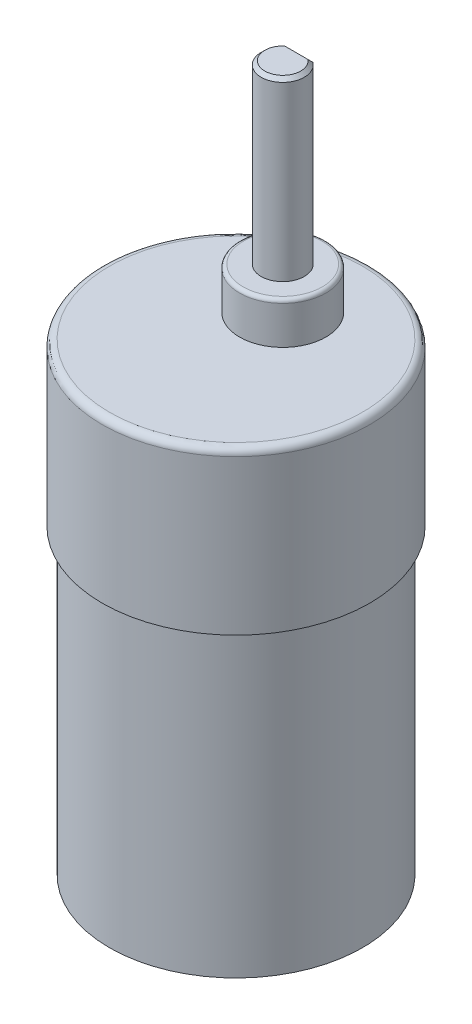
ISO-10303-21;
HEADER;
FILE_DESCRIPTION(('STEP AP214'),'2;1');
FILE_NAME('part.step','',(''),(''),'','','');
FILE_SCHEMA(('AUTOMOTIVE_DESIGN { 1 0 10303 214 1 1 1 1 }'));
ENDSEC;
DATA;
#1=APPLICATION_CONTEXT('core data for automotive mechanical design processes');
#2=APPLICATION_PROTOCOL_DEFINITION('international standard','automotive_design',2000,#1);
#3=PRODUCT_CONTEXT('',#1,'mechanical');
#4=PRODUCT('Part','Part','',(#3));
#5=PRODUCT_RELATED_PRODUCT_CATEGORY('part','',(#4));
#6=PRODUCT_DEFINITION_FORMATION('','',#4);
#7=PRODUCT_DEFINITION_CONTEXT('part definition',#1,'design');
#8=PRODUCT_DEFINITION('design','',#6,#7);
#9=PRODUCT_DEFINITION_SHAPE('','',#8);
#10=(LENGTH_UNIT() NAMED_UNIT(*) SI_UNIT(.MILLI.,.METRE.));
#11=(NAMED_UNIT(*) PLANE_ANGLE_UNIT() SI_UNIT($,.RADIAN.));
#12=(NAMED_UNIT(*) SI_UNIT($,.STERADIAN.) SOLID_ANGLE_UNIT());
#13=UNCERTAINTY_MEASURE_WITH_UNIT(LENGTH_MEASURE(1.E-05),#10,'distance_accuracy_value','');
#14=(GEOMETRIC_REPRESENTATION_CONTEXT(3) GLOBAL_UNCERTAINTY_ASSIGNED_CONTEXT((#13)) GLOBAL_UNIT_ASSIGNED_CONTEXT((#10,
#11,#12)) REPRESENTATION_CONTEXT('',''));
#15=CARTESIAN_POINT('',(0.,0.,0.));
#16=DIRECTION('',(0.,0.,1.));
#17=DIRECTION('',(1.,0.,0.));
#18=AXIS2_PLACEMENT_3D('',#15,#16,#17);
#19=CARTESIAN_POINT('',(0.,52.8,-6.5));
#20=DIRECTION('',(0.,-1.,0.));
#21=DIRECTION('',(0.,0.,-1.));
#22=AXIS2_PLACEMENT_3D('',#19,#20,#21);
#23=CYLINDRICAL_SURFACE('',#22,3.);
#24=DIRECTION('',(0.,-1.,0.));
#25=VECTOR('',#24,1.);
#26=CARTESIAN_POINT('',(1.8,52.8,-8.9));
#27=LINE('',#26,#25);
#28=CARTESIAN_POINT('',(1.8,52.3,-8.9));
#29=VERTEX_POINT('',#28);
#30=CARTESIAN_POINT('',(1.8,28.3,-8.9));
#31=VERTEX_POINT('',#30);
#32=EDGE_CURVE('E89',#29,#31,#27,.T.);
#33=ORIENTED_EDGE('',*,*,#32,.F.);
#34=CARTESIAN_POINT('',(0.,52.3,-6.5));
#35=DIRECTION('',(0.,1.,0.));
#36=DIRECTION('',(0.,0.,1.));
#37=AXIS2_PLACEMENT_3D('',#34,#35,#36);
#38=CIRCLE('',#37,3.);
#39=CARTESIAN_POINT('',(-1.8,52.3,-8.9));
#40=VERTEX_POINT('',#39);
#41=EDGE_CURVE('E12',#29,#40,#38,.F.);
#42=ORIENTED_EDGE('',*,*,#41,.T.);
#43=DIRECTION('',(0.,-1.,0.));
#44=VECTOR('',#43,1.);
#45=CARTESIAN_POINT('',(-1.8,52.8,-8.9));
#46=LINE('',#45,#44);
#47=CARTESIAN_POINT('',(-1.8,28.3,-8.9));
#48=VERTEX_POINT('',#47);
#49=EDGE_CURVE('E96',#40,#48,#46,.T.);
#50=ORIENTED_EDGE('',*,*,#49,.T.);
#51=CARTESIAN_POINT('',(0.,28.3,-6.5));
#52=DIRECTION('',(0.,1.,0.));
#53=DIRECTION('',(0.,0.,1.));
#54=AXIS2_PLACEMENT_3D('',#51,#52,#53);
#55=CIRCLE('',#54,3.);
#56=EDGE_CURVE('E100',#48,#31,#55,.T.);
#57=ORIENTED_EDGE('',*,*,#56,.T.);
#58=EDGE_LOOP('',(#33,#42,#50,#57));
#59=FACE_BOUND('',#58,.T.);
#60=ADVANCED_FACE('F49',(#59),#23,.T.);
#61=CARTESIAN_POINT('',(-1.8,52.8,-8.9));
#62=DIRECTION('',(0.,0.,1.));
#63=DIRECTION('',(1.,0.,0.));
#64=AXIS2_PLACEMENT_3D('',#61,#62,#63);
#65=PLANE('',#64);
#66=ORIENTED_EDGE('',*,*,#49,.F.);
#67=DIRECTION('',(1.,0.,0.));
#68=VECTOR('',#67,1.);
#69=CARTESIAN_POINT('',(1.8,52.3,-8.9));
#70=LINE('',#69,#68);
#71=EDGE_CURVE('E62',#40,#29,#70,.T.);
#72=ORIENTED_EDGE('',*,*,#71,.T.);
#73=ORIENTED_EDGE('',*,*,#32,.T.);
#74=DIRECTION('',(-1.,0.,0.));
#75=VECTOR('',#74,1.);
#76=CARTESIAN_POINT('',(-1.8,28.3,-8.9));
#77=LINE('',#76,#75);
#78=EDGE_CURVE('E92',#31,#48,#77,.T.);
#79=ORIENTED_EDGE('',*,*,#78,.T.);
#80=EDGE_LOOP('',(#66,#72,#73,#79));
#81=FACE_BOUND('',#80,.T.);
#82=ADVANCED_FACE('F91',(#81),#65,.F.);
#83=CARTESIAN_POINT('',(0.,52.8,-6.5));
#84=DIRECTION('',(0.,1.,0.));
#85=DIRECTION('',(0.,0.,1.));
#86=AXIS2_PLACEMENT_3D('',#83,#84,#85);
#87=PLANE('',#86);
#88=CARTESIAN_POINT('',(0.,52.8,-6.5));
#89=DIRECTION('',(0.,1.,0.));
#90=DIRECTION('',(0.,0.,1.));
#91=AXIS2_PLACEMENT_3D('',#88,#89,#90);
#92=CIRCLE('',#91,2.5);
#93=CARTESIAN_POINT('',(-1.62480768092719,52.8,-8.4));
#94=VERTEX_POINT('',#93);
#95=CARTESIAN_POINT('',(1.62480768092719,52.8,-8.4));
#96=VERTEX_POINT('',#95);
#97=EDGE_CURVE('E95',#94,#96,#92,.T.);
#98=ORIENTED_EDGE('',*,*,#97,.T.);
#99=DIRECTION('',(-1.,0.,0.));
#100=VECTOR('',#99,1.);
#101=CARTESIAN_POINT('',(-1.8,52.8,-8.4));
#102=LINE('',#101,#100);
#103=EDGE_CURVE('E107',#96,#94,#102,.T.);
#104=ORIENTED_EDGE('',*,*,#103,.T.);
#105=EDGE_LOOP('',(#98,#104));
#106=FACE_BOUND('',#105,.T.);
#107=ADVANCED_FACE('F123',(#106),#87,.T.);
#108=CARTESIAN_POINT('',(0.,28.3,-6.5));
#109=DIRECTION('',(0.,1.,0.));
#110=DIRECTION('',(0.,0.,1.));
#111=AXIS2_PLACEMENT_3D('',#108,#109,#110);
#112=PLANE('',#111);
#113=ORIENTED_EDGE('',*,*,#56,.F.);
#114=ORIENTED_EDGE('',*,*,#78,.F.);
#115=EDGE_LOOP('',(#113,#114));
#116=FACE_BOUND('',#115,.T.);
#117=ADVANCED_FACE('F99',(#116),#112,.F.);
#118=CARTESIAN_POINT('',(0.,52.8,-6.5));
#119=DIRECTION('',(0.,-1.,0.));
#120=DIRECTION('',(0.,0.,-1.));
#121=AXIS2_PLACEMENT_3D('',#118,#119,#120);
#122=CONICAL_SURFACE('',#121,2.5,0.785398163397443);
#123=CARTESIAN_POINT('',(-1.62480768092719,52.8,-8.4));
#124=CARTESIAN_POINT('',(-1.65541292897536,52.7169127929639,-8.48308720703609));
#125=CARTESIAN_POINT('',(-1.68531495795293,52.6337023873582,-8.56629761264177));
#126=CARTESIAN_POINT('',(-1.74371238852874,52.4670357190947,-8.73296428090534));
#127=CARTESIAN_POINT('',(-1.7722077992421,52.3835794580337,-8.81642054196633));
#128=CARTESIAN_POINT('',(-1.8,52.3,-8.9));
#129=B_SPLINE_CURVE_WITH_KNOTS('',3,(#123,#124,#125,#126,#127,#128),.UNSPECIFIED.,.F.,.F.,(4,2,
4),(0.,0.36425083507371,0.728499309429532),.UNSPECIFIED.);
#130=EDGE_CURVE('E103',#40,#94,#129,.F.);
#131=ORIENTED_EDGE('',*,*,#130,.F.);
#132=ORIENTED_EDGE('',*,*,#41,.F.);
#133=CARTESIAN_POINT('',(1.8,52.3,-8.9));
#134=CARTESIAN_POINT('',(1.7722077992421,52.3835794580337,-8.81642054196633));
#135=CARTESIAN_POINT('',(1.74371238852874,52.4670357190947,-8.73296428090534));
#136=CARTESIAN_POINT('',(1.68531495795293,52.6337023873582,-8.56629761264177));
#137=CARTESIAN_POINT('',(1.65541292897536,52.7169127929639,-8.48308720703609));
#138=CARTESIAN_POINT('',(1.62480768092719,52.8,-8.4));
#139=B_SPLINE_CURVE_WITH_KNOTS('',3,(#133,#134,#135,#136,#137,#138),.UNSPECIFIED.,.F.,.F.,(4,2,
4),(0.,0.364248474355822,0.728499309429532),.UNSPECIFIED.);
#140=EDGE_CURVE('E54',#96,#29,#139,.F.);
#141=ORIENTED_EDGE('',*,*,#140,.F.);
#142=ORIENTED_EDGE('',*,*,#97,.F.);
#143=EDGE_LOOP('',(#131,#132,#141,#142));
#144=FACE_BOUND('',#143,.T.);
#145=ADVANCED_FACE('F113',(#144),#122,.T.);
#146=CARTESIAN_POINT('',(0.,52.8,-8.4));
#147=DIRECTION('',(0.,0.707106781186544,-0.707106781186551));
#148=DIRECTION('',(0.,0.707106781186551,0.707106781186544));
#149=AXIS2_PLACEMENT_3D('',#146,#147,#148);
#150=PLANE('',#149);
#151=ORIENTED_EDGE('',*,*,#140,.T.);
#152=ORIENTED_EDGE('',*,*,#71,.F.);
#153=ORIENTED_EDGE('',*,*,#130,.T.);
#154=ORIENTED_EDGE('',*,*,#103,.F.);
#155=EDGE_LOOP('',(#151,#152,#153,#154));
#156=FACE_BOUND('',#155,.T.);
#157=ADVANCED_FACE('F51',(#156),#150,.T.);
#158=CLOSED_SHELL('',(#60,#82,#107,#117,#145,#157));
#159=MANIFOLD_SOLID_BREP('B2',#158);
#160=CARTESIAN_POINT('',(9.03438594613245,-46.,-9.8));
#161=DIRECTION('',(0.931562549804886,0.,0.363581099345139));
#162=DIRECTION('',(0.363581099345139,0.,-0.931562549804886));
#163=AXIS2_PLACEMENT_3D('',#160,#161,#162);
#164=PLANE('',#163);
#165=DIRECTION('',(0.363581099345139,0.,-0.931562549804886));
#166=VECTOR('',#165,1.);
#167=CARTESIAN_POINT('',(9.03438594613245,-46.,-9.8));
#168=LINE('',#167,#166);
#169=CARTESIAN_POINT('',(8.12543319776952,-46.,-7.47109362548758));
#170=VERTEX_POINT('',#169);
#171=CARTESIAN_POINT('',(8.85259539645988,-46.,-9.33421872509756));
#172=VERTEX_POINT('',#171);
#173=EDGE_CURVE('E297',#170,#172,#168,.T.);
#174=ORIENTED_EDGE('',*,*,#173,.F.);
#175=DIRECTION('',(0.257090660858204,-0.707106781186558,-0.658714196066456));
#176=VECTOR('',#175,1.);
#177=CARTESIAN_POINT('',(8.12543319776952,-46.,-7.47109362548758));
#178=LINE('',#177,#176);
#179=CARTESIAN_POINT('',(7.94364264809696,-45.5,-7.00531235058515));
#180=VERTEX_POINT('',#179);
#181=EDGE_CURVE('E364',#170,#180,#178,.F.);
#182=ORIENTED_EDGE('',*,*,#181,.T.);
#183=DIRECTION('',(0.,1.,0.));
#184=VECTOR('',#183,1.);
#185=CARTESIAN_POINT('',(7.94364264809696,-46.,-7.00531235058515));
#186=LINE('',#185,#184);
#187=CARTESIAN_POINT('',(7.94364264809696,-41.,-7.00531235058515));
#188=VERTEX_POINT('',#187);
#189=EDGE_CURVE('E282',#180,#188,#186,.T.);
#190=ORIENTED_EDGE('',*,*,#189,.T.);
#191=DIRECTION('',(0.363581099345139,0.,-0.931562549804886));
#192=VECTOR('',#191,1.);
#193=CARTESIAN_POINT('',(9.03438594613245,-41.,-9.8));
#194=LINE('',#193,#192);
#195=CARTESIAN_POINT('',(9.03438594613245,-41.,-9.8));
#196=VERTEX_POINT('',#195);
#197=EDGE_CURVE('E278',#188,#196,#194,.T.);
#198=ORIENTED_EDGE('',*,*,#197,.T.);
#199=DIRECTION('',(0.,1.,0.));
#200=VECTOR('',#199,1.);
#201=CARTESIAN_POINT('',(9.03438594613245,-46.,-9.8));
#202=LINE('',#201,#200);
#203=CARTESIAN_POINT('',(9.03438594613245,-45.5,-9.8));
#204=VERTEX_POINT('',#203);
#205=EDGE_CURVE('E263',#204,#196,#202,.T.);
#206=ORIENTED_EDGE('',*,*,#205,.F.);
#207=DIRECTION('',(0.257090660858206,0.707106781186553,-0.65871419606646));
#208=VECTOR('',#207,1.);
#209=CARTESIAN_POINT('',(8.85259539645988,-46.,-9.33421872509756));
#210=LINE('',#209,#208);
#211=EDGE_CURVE('E362',#204,#172,#210,.F.);
#212=ORIENTED_EDGE('',*,*,#211,.T.);
#213=EDGE_LOOP('',(#174,#182,#190,#198,#206,#212));
#214=FACE_BOUND('',#213,.T.);
#215=CARTESIAN_POINT('',(8.48901429711467,-45.,-8.40265617529258));
#216=DIRECTION('',(0.931562549804886,0.,0.363581099345139));
#217=DIRECTION('',(0.363581099345139,0.,-0.931562549804886));
#218=AXIS2_PLACEMENT_3D('',#215,#216,#217);
#219=CIRCLE('',#218,0.500000000000004);
#220=CARTESIAN_POINT('',(8.67080484678724,-45.,-8.86843745019503));
#221=VERTEX_POINT('',#220);
#222=EDGE_CURVE('E356',#221,#221,#219,.T.);
#223=ORIENTED_EDGE('',*,*,#222,.T.);
#224=EDGE_LOOP('',(#223));
#225=FACE_BOUND('',#224,.T.);
#226=ADVANCED_FACE('F173',(#214,#225),#164,.F.);
#227=CARTESIAN_POINT('',(8.4094239229994,-46.,-6.82352180091257));
#228=DIRECTION('',(-0.931562549804876,0.,-0.363581099345163));
#229=DIRECTION('',(-0.363581099345163,0.,0.931562549804876));
#230=AXIS2_PLACEMENT_3D('',#227,#228,#229);
#231=PLANE('',#230);
#232=DIRECTION('',(0.,1.,0.));
#233=VECTOR('',#232,1.);
#234=CARTESIAN_POINT('',(8.4094239229994,-46.,-6.82352180091257));
#235=LINE('',#234,#233);
#236=CARTESIAN_POINT('',(8.4094239229994,-45.5,-6.82352180091257));
#237=VERTEX_POINT('',#236);
#238=CARTESIAN_POINT('',(8.4094239229994,-41.,-6.82352180091257));
#239=VERTEX_POINT('',#238);
#240=EDGE_CURVE('E299',#237,#239,#235,.T.);
#241=ORIENTED_EDGE('',*,*,#240,.F.);
#242=DIRECTION('',(-0.257090660858221,0.707106781186557,0.65871419606645));
#243=VECTOR('',#242,1.);
#244=CARTESIAN_POINT('',(8.59121447267197,-46.,-7.28930307581499));
#245=LINE('',#244,#243);
#246=CARTESIAN_POINT('',(8.59121447267197,-46.,-7.28930307581499));
#247=VERTEX_POINT('',#246);
#248=EDGE_CURVE('E370',#237,#247,#245,.F.);
#249=ORIENTED_EDGE('',*,*,#248,.T.);
#250=DIRECTION('',(-0.363581099345163,0.,0.931562549804876));
#251=VECTOR('',#250,1.);
#252=CARTESIAN_POINT('',(8.4094239229994,-46.,-6.82352180091257));
#253=LINE('',#252,#251);
#254=CARTESIAN_POINT('',(9.31837667136231,-46.,-9.15242817542476));
#255=VERTEX_POINT('',#254);
#256=EDGE_CURVE('E300',#255,#247,#253,.T.);
#257=ORIENTED_EDGE('',*,*,#256,.F.);
#258=DIRECTION('',(-0.257090660858222,-0.707106781186553,0.658714196066453));
#259=VECTOR('',#258,1.);
#260=CARTESIAN_POINT('',(9.31837667136235,-45.9999999999999,-9.15242817542486));
#261=LINE('',#260,#259);
#262=CARTESIAN_POINT('',(9.50016722103489,-45.5,-9.6182094503272));
#263=VERTEX_POINT('',#262);
#264=EDGE_CURVE('E368',#255,#263,#261,.F.);
#265=ORIENTED_EDGE('',*,*,#264,.T.);
#266=DIRECTION('',(0.,1.,0.));
#267=VECTOR('',#266,1.);
#268=CARTESIAN_POINT('',(9.50016722103489,-46.,-9.6182094503272));
#269=LINE('',#268,#267);
#270=CARTESIAN_POINT('',(9.50016722103489,-41.,-9.6182094503272));
#271=VERTEX_POINT('',#270);
#272=EDGE_CURVE('E275',#263,#271,#269,.T.);
#273=ORIENTED_EDGE('',*,*,#272,.T.);
#274=DIRECTION('',(-0.363581099345163,0.,0.931562549804876));
#275=VECTOR('',#274,1.);
#276=CARTESIAN_POINT('',(8.4094239229994,-41.,-6.82352180091257));
#277=LINE('',#276,#275);
#278=EDGE_CURVE('E290',#271,#239,#277,.T.);
#279=ORIENTED_EDGE('',*,*,#278,.T.);
#280=EDGE_LOOP('',(#241,#249,#257,#265,#273,#279));
#281=FACE_BOUND('',#280,.T.);
#282=CARTESIAN_POINT('',(8.95479557201718,-45.,-8.22086562561998));
#283=DIRECTION('',(-0.931562549804876,0.,-0.363581099345163));
#284=DIRECTION('',(-0.363581099345163,0.,0.931562549804876));
#285=AXIS2_PLACEMENT_3D('',#282,#283,#284);
#286=CIRCLE('',#285,0.500000000000004);
#287=CARTESIAN_POINT('',(8.7730050223446,-45.,-7.75508435071754));
#288=VERTEX_POINT('',#287);
#289=EDGE_CURVE('E353',#288,#288,#286,.F.);
#290=ORIENTED_EDGE('',*,*,#289,.F.);
#291=EDGE_LOOP('',(#290));
#292=FACE_BOUND('',#291,.T.);
#293=ADVANCED_FACE('F415',(#281,#292),#231,.F.);
#294=CARTESIAN_POINT('',(0.,-41.,0.));
#295=DIRECTION('',(0.,-1.,0.));
#296=DIRECTION('',(0.,0.,-1.));
#297=AXIS2_PLACEMENT_3D('',#294,#295,#296);
#298=PLANE('',#297);
#299=DIRECTION('',(-0.931562549804876,0.,0.363581099345164));
#300=VECTOR('',#299,1.);
#301=CARTESIAN_POINT('',(-8.40942392299948,-41.,-6.82352180091257));
#302=LINE('',#301,#300);
#303=CARTESIAN_POINT('',(-7.94364264809704,-41.,-7.00531235058515));
#304=VERTEX_POINT('',#303);
#305=CARTESIAN_POINT('',(-8.40942392299948,-41.,-6.82352180091257));
#306=VERTEX_POINT('',#305);
#307=EDGE_CURVE('E313',#304,#306,#302,.T.);
#308=ORIENTED_EDGE('',*,*,#307,.F.);
#309=DIRECTION('',(0.363581099345165,0.,0.931562549804876));
#310=VECTOR('',#309,1.);
#311=CARTESIAN_POINT('',(-7.94364264809704,-41.,-7.00531235058515));
#312=LINE('',#311,#310);
#313=CARTESIAN_POINT('',(-9.03438594613253,-41.,-9.79999999999979));
#314=VERTEX_POINT('',#313);
#315=EDGE_CURVE('E274',#314,#304,#312,.T.);
#316=ORIENTED_EDGE('',*,*,#315,.F.);
#317=DIRECTION('',(0.931562549804854,0.,-0.36358109934522));
#318=VECTOR('',#317,1.);
#319=CARTESIAN_POINT('',(-9.03438594613253,-41.,-9.79999999999979));
#320=LINE('',#319,#318);
#321=CARTESIAN_POINT('',(-9.50016722103496,-41.,-9.61820945032717));
#322=VERTEX_POINT('',#321);
#323=EDGE_CURVE('E307',#322,#314,#320,.T.);
#324=ORIENTED_EDGE('',*,*,#323,.F.);
#325=DIRECTION('',(-0.363581099345165,0.,-0.931562549804876));
#326=VECTOR('',#325,1.);
#327=CARTESIAN_POINT('',(-9.50016722103496,-41.,-9.61820945032718));
#328=LINE('',#327,#326);
#329=EDGE_CURVE('E316',#306,#322,#328,.T.);
#330=ORIENTED_EDGE('',*,*,#329,.F.);
#331=EDGE_LOOP('',(#308,#316,#324,#330));
#332=FACE_BOUND('',#331,.T.);
#333=CARTESIAN_POINT('',(0.,-41.,0.));
#334=DIRECTION('',(0.,-1.,0.));
#335=DIRECTION('',(0.,0.,-1.));
#336=AXIS2_PLACEMENT_3D('',#333,#334,#335);
#337=CIRCLE('',#336,17.);
#338=CARTESIAN_POINT('',(0.,-41.,-17.));
#339=VERTEX_POINT('',#338);
#340=EDGE_CURVE('E332',#339,#339,#337,.T.);
#341=ORIENTED_EDGE('',*,*,#340,.T.);
#342=EDGE_LOOP('',(#341));
#343=FACE_BOUND('',#342,.T.);
#344=CARTESIAN_POINT('',(0.,-41.,0.));
#345=DIRECTION('',(0.,-1.,0.));
#346=DIRECTION('',(0.,0.,-1.));
#347=AXIS2_PLACEMENT_3D('',#344,#345,#346);
#348=CIRCLE('',#347,4.9);
#349=CARTESIAN_POINT('',(0.,-41.,-4.9));
#350=VERTEX_POINT('',#349);
#351=EDGE_CURVE('E328',#350,#350,#348,.T.);
#352=ORIENTED_EDGE('',*,*,#351,.F.);
#353=EDGE_LOOP('',(#352));
#354=FACE_BOUND('',#353,.T.);
#355=DIRECTION('',(0.931562549804728,0.,0.363581099345543));
#356=VECTOR('',#355,1.);
#357=CARTESIAN_POINT('',(9.50016722103489,-41.,-9.6182094503272));
#358=LINE('',#357,#356);
#359=EDGE_CURVE('E268',#196,#271,#358,.T.);
#360=ORIENTED_EDGE('',*,*,#359,.F.);
#361=ORIENTED_EDGE('',*,*,#197,.F.);
#362=DIRECTION('',(-0.931562549804877,0.,-0.363581099345161));
#363=VECTOR('',#362,1.);
#364=CARTESIAN_POINT('',(7.94364264809696,-41.,-7.00531235058515));
#365=LINE('',#364,#363);
#366=EDGE_CURVE('E292',#239,#188,#365,.T.);
#367=ORIENTED_EDGE('',*,*,#366,.F.);
#368=ORIENTED_EDGE('',*,*,#278,.F.);
#369=EDGE_LOOP('',(#360,#361,#367,#368));
#370=FACE_BOUND('',#369,.T.);
#371=ADVANCED_FACE('F288',(#332,#343,#354,#370),#298,.T.);
#372=CARTESIAN_POINT('',(0.,0.,0.));
#373=DIRECTION('',(0.,1.,0.));
#374=DIRECTION('',(0.,0.,1.));
#375=AXIS2_PLACEMENT_3D('',#372,#373,#374);
#376=PLANE('',#375);
#377=CARTESIAN_POINT('',(0.,0.,0.));
#378=DIRECTION('',(0.,1.,0.));
#379=DIRECTION('',(0.,0.,1.));
#380=AXIS2_PLACEMENT_3D('',#377,#378,#379);
#381=CIRCLE('',#380,18.6);
#382=CARTESIAN_POINT('',(0.,0.,-18.6));
#383=VERTEX_POINT('',#382);
#384=EDGE_CURVE('E343',#383,#383,#381,.T.);
#385=ORIENTED_EDGE('',*,*,#384,.F.);
#386=EDGE_LOOP('',(#385));
#387=FACE_BOUND('',#386,.T.);
#388=CARTESIAN_POINT('',(0.,0.,0.));
#389=DIRECTION('',(0.,1.,0.));
#390=DIRECTION('',(0.,0.,1.));
#391=AXIS2_PLACEMENT_3D('',#388,#389,#390);
#392=CIRCLE('',#391,17.6);
#393=CARTESIAN_POINT('',(0.,0.,17.6));
#394=VERTEX_POINT('',#393);
#395=EDGE_CURVE('E346',#394,#394,#392,.F.);
#396=ORIENTED_EDGE('',*,*,#395,.F.);
#397=EDGE_LOOP('',(#396));
#398=FACE_BOUND('',#397,.T.);
#399=ADVANCED_FACE('F452',(#387,#398),#376,.F.);
#400=CARTESIAN_POINT('',(0.,22.5,0.));
#401=DIRECTION('',(0.,1.,0.));
#402=DIRECTION('',(0.,0.,1.));
#403=AXIS2_PLACEMENT_3D('',#400,#401,#402);
#404=PLANE('',#403);
#405=CARTESIAN_POINT('',(0.,22.5,0.));
#406=DIRECTION('',(0.,1.,0.));
#407=DIRECTION('',(0.,0.,1.));
#408=AXIS2_PLACEMENT_3D('',#405,#406,#407);
#409=CIRCLE('',#408,17.6);
#410=CARTESIAN_POINT('',(0.,22.5,17.6));
#411=VERTEX_POINT('',#410);
#412=EDGE_CURVE('E389',#411,#411,#409,.T.);
#413=ORIENTED_EDGE('',*,*,#412,.T.);
#414=EDGE_LOOP('',(#413));
#415=FACE_BOUND('',#414,.T.);
#416=CARTESIAN_POINT('',(0.,22.5,-6.5));
#417=DIRECTION('',(0.,1.,0.));
#418=DIRECTION('',(0.,0.,1.));
#419=AXIS2_PLACEMENT_3D('',#416,#417,#418);
#420=CIRCLE('',#419,6.);
#421=CARTESIAN_POINT('',(0.,22.5,-0.499999999999999));
#422=VERTEX_POINT('',#421);
#423=EDGE_CURVE('E340',#422,#422,#420,.T.);
#424=ORIENTED_EDGE('',*,*,#423,.F.);
#425=EDGE_LOOP('',(#424));
#426=FACE_BOUND('',#425,.T.);
#427=ADVANCED_FACE('F474',(#415,#426),#404,.T.);
#428=CARTESIAN_POINT('',(0.,22.5,0.));
#429=DIRECTION('',(0.,-1.,0.));
#430=DIRECTION('',(0.,0.,-1.));
#431=AXIS2_PLACEMENT_3D('',#428,#429,#430);
#432=CYLINDRICAL_SURFACE('',#431,18.6);
#433=CARTESIAN_POINT('',(0.,21.5,0.));
#434=DIRECTION('',(0.,1.,0.));
#435=DIRECTION('',(0.,0.,1.));
#436=AXIS2_PLACEMENT_3D('',#433,#434,#435);
#437=CIRCLE('',#436,18.6);
#438=CARTESIAN_POINT('',(0.,21.5,-18.6));
#439=VERTEX_POINT('',#438);
#440=EDGE_CURVE('E392',#439,#439,#437,.F.);
#441=CARTESIAN_POINT('',(0.,21.5,-18.6));
#442=CARTESIAN_POINT('',(0.,21.2760416666667,-18.6));
#443=CARTESIAN_POINT('',(0.,21.0520833333333,-18.6));
#444=CARTESIAN_POINT('',(0.,20.6041666666667,-18.6));
#445=CARTESIAN_POINT('',(0.,20.3802083333333,-18.6));
#446=CARTESIAN_POINT('',(0.,19.9322916666667,-18.6));
#447=CARTESIAN_POINT('',(0.,19.7083333333333,-18.6));
#448=CARTESIAN_POINT('',(0.,19.2604166666667,-18.6));
#449=CARTESIAN_POINT('',(0.,19.0364583333333,-18.6));
#450=CARTESIAN_POINT('',(0.,18.5885416666667,-18.6));
#451=CARTESIAN_POINT('',(0.,18.3645833333333,-18.6));
#452=CARTESIAN_POINT('',(0.,17.9166666666667,-18.6));
#453=CARTESIAN_POINT('',(0.,17.6927083333333,-18.6));
#454=CARTESIAN_POINT('',(0.,17.2447916666667,-18.6));
#455=CARTESIAN_POINT('',(0.,17.0208333333333,-18.6));
#456=CARTESIAN_POINT('',(0.,16.5729166666667,-18.6));
#457=CARTESIAN_POINT('',(0.,16.3489583333333,-18.6));
#458=CARTESIAN_POINT('',(0.,15.9010416666667,-18.6));
#459=CARTESIAN_POINT('',(0.,15.6770833333333,-18.6));
#460=CARTESIAN_POINT('',(0.,15.2291666666667,-18.6));
#461=CARTESIAN_POINT('',(0.,15.0052083333333,-18.6));
#462=CARTESIAN_POINT('',(0.,14.5572916666667,-18.6));
#463=CARTESIAN_POINT('',(0.,14.3333333333333,-18.6));
#464=CARTESIAN_POINT('',(0.,13.8854166666667,-18.6));
#465=CARTESIAN_POINT('',(0.,13.6614583333333,-18.6));
#466=CARTESIAN_POINT('',(0.,13.2135416666667,-18.6));
#467=CARTESIAN_POINT('',(0.,12.9895833333333,-18.6));
#468=CARTESIAN_POINT('',(0.,12.5416666666667,-18.6));
#469=CARTESIAN_POINT('',(0.,12.3177083333333,-18.6));
#470=CARTESIAN_POINT('',(0.,11.8697916666667,-18.6));
#471=CARTESIAN_POINT('',(0.,11.6458333333333,-18.6));
#472=CARTESIAN_POINT('',(0.,11.1979166666667,-18.6));
#473=CARTESIAN_POINT('',(0.,10.9739583333333,-18.6));
#474=CARTESIAN_POINT('',(0.,10.5260416666667,-18.6));
#475=CARTESIAN_POINT('',(0.,10.3020833333333,-18.6));
#476=CARTESIAN_POINT('',(0.,9.85416666666666,-18.6));
#477=CARTESIAN_POINT('',(0.,9.63020833333333,-18.6));
#478=CARTESIAN_POINT('',(0.,9.18229166666666,-18.6));
#479=CARTESIAN_POINT('',(0.,8.95833333333333,-18.6));
#480=CARTESIAN_POINT('',(0.,8.51041666666666,-18.6));
#481=CARTESIAN_POINT('',(0.,8.28645833333333,-18.6));
#482=CARTESIAN_POINT('',(0.,7.83854166666666,-18.6));
#483=CARTESIAN_POINT('',(0.,7.61458333333333,-18.6));
#484=CARTESIAN_POINT('',(0.,7.16666666666667,-18.6));
#485=CARTESIAN_POINT('',(0.,6.94270833333333,-18.6));
#486=CARTESIAN_POINT('',(0.,6.49479166666667,-18.6));
#487=CARTESIAN_POINT('',(0.,6.27083333333333,-18.6));
#488=CARTESIAN_POINT('',(0.,5.82291666666666,-18.6));
#489=CARTESIAN_POINT('',(0.,5.59895833333333,-18.6));
#490=CARTESIAN_POINT('',(0.,5.15104166666666,-18.6));
#491=CARTESIAN_POINT('',(0.,4.92708333333333,-18.6));
#492=CARTESIAN_POINT('',(0.,4.47916666666666,-18.6));
#493=CARTESIAN_POINT('',(0.,4.25520833333333,-18.6));
#494=CARTESIAN_POINT('',(0.,3.80729166666666,-18.6));
#495=CARTESIAN_POINT('',(0.,3.58333333333333,-18.6));
#496=CARTESIAN_POINT('',(0.,3.13541666666666,-18.6));
#497=CARTESIAN_POINT('',(0.,2.91145833333333,-18.6));
#498=CARTESIAN_POINT('',(0.,2.46354166666666,-18.6));
#499=CARTESIAN_POINT('',(0.,2.23958333333333,-18.6));
#500=CARTESIAN_POINT('',(0.,1.79166666666666,-18.6));
#501=CARTESIAN_POINT('',(0.,1.56770833333333,-18.6));
#502=CARTESIAN_POINT('',(0.,1.11979166666666,-18.6));
#503=CARTESIAN_POINT('',(0.,0.895833333333329,-18.6));
#504=CARTESIAN_POINT('',(0.,0.447916666666662,-18.6));
#505=CARTESIAN_POINT('',(0.,0.223958333333329,-18.6));
#506=CARTESIAN_POINT('',(0.,0.,-18.6));
#507=B_SPLINE_CURVE_WITH_KNOTS('',3,(#441,#442,#443,#444,#445,#446,#447,#448,#449,#450,#451,
#452,#453,#454,#455,#456,#457,#458,#459,#460,#461,#462,#463,#464,#465,#466,#467,#468,#469,#470,
#471,#472,#473,#474,#475,#476,#477,#478,#479,#480,#481,#482,#483,#484,#485,#486,#487,#488,#489,
#490,#491,#492,#493,#494,#495,#496,#497,#498,#499,#500,#501,#502,#503,#504,#505,#506),
.UNSPECIFIED.,.F.,.F.,(4,2,2,2,2,2,2,2,2,2,2,2,2,2,2,2,2,2,2,2,2,2,2,2,2,2,2,2,2,2,2,2,4),(0.,
0.671874999999999,1.34375,2.015625,2.6875,3.359375,4.03125,4.703125,5.375,6.046875,6.71875,
7.390625,8.0625,8.734375,9.40625,10.078125,10.75,11.421875,12.09375,12.765625,13.4375,14.109375,
14.78125,15.453125,16.125,16.796875,17.46875,18.140625,18.8125,19.484375,20.15625,20.828125,
21.5),.UNSPECIFIED.);
#508=EDGE_CURVE('BSEAM472',#439,#383,#507,.T.);
#509=ORIENTED_EDGE('',*,*,#440,.T.);
#510=ORIENTED_EDGE('',*,*,#384,.T.);
#511=ORIENTED_EDGE('',*,*,#508,.T.);
#512=ORIENTED_EDGE('',*,*,#508,.F.);
#513=EDGE_LOOP('',(#509,#511,#510,#512));
#514=FACE_BOUND('',#513,.T.);
#515=ADVANCED_FACE('F472',(#514),#432,.T.);
#516=CARTESIAN_POINT('',(0.,28.3,-6.5));
#517=DIRECTION('',(0.,-1.,0.));
#518=DIRECTION('',(0.,0.,-1.));
#519=AXIS2_PLACEMENT_3D('',#516,#517,#518);
#520=CYLINDRICAL_SURFACE('',#519,6.);
#521=CARTESIAN_POINT('',(0.,27.8,-6.5));
#522=DIRECTION('',(0.,1.,0.));
#523=DIRECTION('',(0.,0.,1.));
#524=AXIS2_PLACEMENT_3D('',#521,#522,#523);
#525=CIRCLE('',#524,6.);
#526=CARTESIAN_POINT('',(0.,27.8,-0.499999999999999));
#527=VERTEX_POINT('',#526);
#528=EDGE_CURVE('E398',#527,#527,#525,.F.);
#529=ORIENTED_EDGE('',*,*,#528,.T.);
#530=EDGE_LOOP('',(#529));
#531=FACE_BOUND('',#530,.T.);
#532=ORIENTED_EDGE('',*,*,#423,.T.);
#533=EDGE_LOOP('',(#532));
#534=FACE_BOUND('',#533,.T.);
#535=ADVANCED_FACE('F468',(#531,#534),#520,.T.);
#536=CARTESIAN_POINT('',(0.,28.3,-6.5));
#537=DIRECTION('',(0.,1.,0.));
#538=DIRECTION('',(0.,0.,1.));
#539=AXIS2_PLACEMENT_3D('',#536,#537,#538);
#540=PLANE('',#539);
#541=CARTESIAN_POINT('',(0.,28.3,-6.5));
#542=DIRECTION('',(0.,1.,0.));
#543=DIRECTION('',(0.,0.,1.));
#544=AXIS2_PLACEMENT_3D('',#541,#542,#543);
#545=CIRCLE('',#544,5.5);
#546=CARTESIAN_POINT('',(0.,28.3,-0.999999999999998));
#547=VERTEX_POINT('',#546);
#548=EDGE_CURVE('E395',#547,#547,#545,.T.);
#549=ORIENTED_EDGE('',*,*,#548,.T.);
#550=EDGE_LOOP('',(#549));
#551=FACE_BOUND('',#550,.T.);
#552=ADVANCED_FACE('F464',(#551),#540,.T.);
#553=CARTESIAN_POINT('',(0.,-42.,0.));
#554=DIRECTION('',(0.,1.,0.));
#555=DIRECTION('',(0.,0.,1.));
#556=AXIS2_PLACEMENT_3D('',#553,#554,#555);
#557=CYLINDRICAL_SURFACE('',#556,17.6);
#558=CARTESIAN_POINT('',(0.,-42.,0.));
#559=DIRECTION('',(0.,-1.,0.));
#560=DIRECTION('',(0.,0.,-1.));
#561=AXIS2_PLACEMENT_3D('',#558,#559,#560);
#562=CIRCLE('',#561,17.6);
#563=CARTESIAN_POINT('',(0.,-42.,17.6));
#564=VERTEX_POINT('',#563);
#565=EDGE_CURVE('E335',#564,#564,#562,.T.);
#566=CARTESIAN_POINT('',(0.,-42.,17.6));
#567=CARTESIAN_POINT('',(0.,-41.5625,17.6));
#568=CARTESIAN_POINT('',(0.,-41.125,17.6));
#569=CARTESIAN_POINT('',(0.,-40.25,17.6));
#570=CARTESIAN_POINT('',(0.,-39.8125,17.6));
#571=CARTESIAN_POINT('',(0.,-38.9375,17.6));
#572=CARTESIAN_POINT('',(0.,-38.5,17.6));
#573=CARTESIAN_POINT('',(0.,-37.625,17.6));
#574=CARTESIAN_POINT('',(0.,-37.1875,17.6));
#575=CARTESIAN_POINT('',(0.,-36.3125,17.6));
#576=CARTESIAN_POINT('',(0.,-35.875,17.6));
#577=CARTESIAN_POINT('',(0.,-35.,17.6));
#578=CARTESIAN_POINT('',(0.,-34.5625,17.6));
#579=CARTESIAN_POINT('',(0.,-33.6875,17.6));
#580=CARTESIAN_POINT('',(0.,-33.25,17.6));
#581=CARTESIAN_POINT('',(0.,-32.375,17.6));
#582=CARTESIAN_POINT('',(0.,-31.9375,17.6));
#583=CARTESIAN_POINT('',(0.,-31.0625,17.6));
#584=CARTESIAN_POINT('',(0.,-30.625,17.6));
#585=CARTESIAN_POINT('',(0.,-29.75,17.6));
#586=CARTESIAN_POINT('',(0.,-29.3125,17.6));
#587=CARTESIAN_POINT('',(0.,-28.4375,17.6));
#588=CARTESIAN_POINT('',(0.,-28.,17.6));
#589=CARTESIAN_POINT('',(0.,-27.125,17.6));
#590=CARTESIAN_POINT('',(0.,-26.6875,17.6));
#591=CARTESIAN_POINT('',(0.,-25.8125,17.6));
#592=CARTESIAN_POINT('',(0.,-25.375,17.6));
#593=CARTESIAN_POINT('',(0.,-24.5,17.6));
#594=CARTESIAN_POINT('',(0.,-24.0625,17.6));
#595=CARTESIAN_POINT('',(0.,-23.1875,17.6));
#596=CARTESIAN_POINT('',(0.,-22.75,17.6));
#597=CARTESIAN_POINT('',(0.,-21.875,17.6));
#598=CARTESIAN_POINT('',(0.,-21.4375,17.6));
#599=CARTESIAN_POINT('',(0.,-20.5625,17.6));
#600=CARTESIAN_POINT('',(0.,-20.125,17.6));
#601=CARTESIAN_POINT('',(0.,-19.25,17.6));
#602=CARTESIAN_POINT('',(0.,-18.8125,17.6));
#603=CARTESIAN_POINT('',(0.,-17.9375,17.6));
#604=CARTESIAN_POINT('',(0.,-17.5,17.6));
#605=CARTESIAN_POINT('',(0.,-16.625,17.6));
#606=CARTESIAN_POINT('',(0.,-16.1875,17.6));
#607=CARTESIAN_POINT('',(0.,-15.3125,17.6));
#608=CARTESIAN_POINT('',(0.,-14.875,17.6));
#609=CARTESIAN_POINT('',(0.,-14.,17.6));
#610=CARTESIAN_POINT('',(0.,-13.5625,17.6));
#611=CARTESIAN_POINT('',(0.,-12.6875,17.6));
#612=CARTESIAN_POINT('',(0.,-12.25,17.6));
#613=CARTESIAN_POINT('',(0.,-11.375,17.6));
#614=CARTESIAN_POINT('',(0.,-10.9375,17.6));
#615=CARTESIAN_POINT('',(0.,-10.0625,17.6));
#616=CARTESIAN_POINT('',(0.,-9.625,17.6));
#617=CARTESIAN_POINT('',(0.,-8.75,17.6));
#618=CARTESIAN_POINT('',(0.,-8.3125,17.6));
#619=CARTESIAN_POINT('',(0.,-7.4375,17.6));
#620=CARTESIAN_POINT('',(0.,-7.,17.6));
#621=CARTESIAN_POINT('',(0.,-6.125,17.6));
#622=CARTESIAN_POINT('',(0.,-5.6875,17.6));
#623=CARTESIAN_POINT('',(0.,-4.8125,17.6));
#624=CARTESIAN_POINT('',(0.,-4.375,17.6));
#625=CARTESIAN_POINT('',(0.,-3.5,17.6));
#626=CARTESIAN_POINT('',(0.,-3.0625,17.6));
#627=CARTESIAN_POINT('',(0.,-2.1875,17.6));
#628=CARTESIAN_POINT('',(0.,-1.75,17.6));
#629=CARTESIAN_POINT('',(0.,-0.875000000000001,17.6));
#630=CARTESIAN_POINT('',(0.,-0.4375,17.6));
#631=CARTESIAN_POINT('',(0.,0.,17.6));
#632=B_SPLINE_CURVE_WITH_KNOTS('',3,(#566,#567,#568,#569,#570,#571,#572,#573,#574,#575,#576,
#577,#578,#579,#580,#581,#582,#583,#584,#585,#586,#587,#588,#589,#590,#591,#592,#593,#594,#595,
#596,#597,#598,#599,#600,#601,#602,#603,#604,#605,#606,#607,#608,#609,#610,#611,#612,#613,#614,
#615,#616,#617,#618,#619,#620,#621,#622,#623,#624,#625,#626,#627,#628,#629,#630,#631),
.UNSPECIFIED.,.F.,.F.,(4,2,2,2,2,2,2,2,2,2,2,2,2,2,2,2,2,2,2,2,2,2,2,2,2,2,2,2,2,2,2,2,4),(0.,
1.3125,2.625,3.9375,5.25,6.56250000000001,7.875,9.1875,10.5,11.8125,13.125,14.4375,15.75,
17.0625,18.375,19.6875,21.,22.3125,23.625,24.9375,26.25,27.5625,28.875,30.1875,31.5,32.8125,
34.125,35.4375,36.75,38.0625,39.375,40.6875,42.),.UNSPECIFIED.);
#633=EDGE_CURVE('BSEAM460',#564,#394,#632,.T.);
#634=ORIENTED_EDGE('',*,*,#565,.F.);
#635=ORIENTED_EDGE('',*,*,#395,.T.);
#636=ORIENTED_EDGE('',*,*,#633,.T.);
#637=ORIENTED_EDGE('',*,*,#633,.F.);
#638=EDGE_LOOP('',(#634,#636,#635,#637));
#639=FACE_BOUND('',#638,.T.);
#640=ADVANCED_FACE('F460',(#639),#557,.T.);
#641=CARTESIAN_POINT('',(0.,-42.,0.));
#642=DIRECTION('',(0.,-1.,0.));
#643=DIRECTION('',(0.,0.,-1.));
#644=AXIS2_PLACEMENT_3D('',#641,#642,#643);
#645=PLANE('',#644);
#646=CARTESIAN_POINT('',(0.,-42.,0.));
#647=DIRECTION('',(0.,-1.,0.));
#648=DIRECTION('',(0.,0.,-1.));
#649=AXIS2_PLACEMENT_3D('',#646,#647,#648);
#650=CIRCLE('',#649,17.);
#651=CARTESIAN_POINT('',(0.,-42.,-17.));
#652=VERTEX_POINT('',#651);
#653=EDGE_CURVE('E331',#652,#652,#650,.T.);
#654=ORIENTED_EDGE('',*,*,#653,.F.);
#655=EDGE_LOOP('',(#654));
#656=FACE_BOUND('',#655,.T.);
#657=ORIENTED_EDGE('',*,*,#565,.T.);
#658=EDGE_LOOP('',(#657));
#659=FACE_BOUND('',#658,.T.);
#660=ADVANCED_FACE('F456',(#656,#659),#645,.T.);
#661=CARTESIAN_POINT('',(0.,-41.,0.));
#662=DIRECTION('',(0.,-1.,0.));
#663=DIRECTION('',(0.,0.,-1.));
#664=AXIS2_PLACEMENT_3D('',#661,#662,#663);
#665=CYLINDRICAL_SURFACE('',#664,17.);
#666=ORIENTED_EDGE('',*,*,#340,.F.);
#667=EDGE_LOOP('',(#666));
#668=FACE_BOUND('',#667,.T.);
#669=ORIENTED_EDGE('',*,*,#653,.T.);
#670=EDGE_LOOP('',(#669));
#671=FACE_BOUND('',#670,.T.);
#672=ADVANCED_FACE('F448',(#668,#671),#665,.F.);
#673=CARTESIAN_POINT('',(0.,-44.7,0.));
#674=DIRECTION('',(0.,1.,0.));
#675=DIRECTION('',(0.,0.,1.));
#676=AXIS2_PLACEMENT_3D('',#673,#674,#675);
#677=CYLINDRICAL_SURFACE('',#676,4.9);
#678=CARTESIAN_POINT('',(0.,-42.7,0.));
#679=DIRECTION('',(0.,-1.,0.));
#680=DIRECTION('',(0.,0.,-1.));
#681=AXIS2_PLACEMENT_3D('',#678,#679,#680);
#682=CIRCLE('',#681,4.9);
#683=CARTESIAN_POINT('',(0.,-42.7,-4.9));
#684=VERTEX_POINT('',#683);
#685=EDGE_CURVE('E47',#684,#684,#682,.F.);
#686=ORIENTED_EDGE('',*,*,#685,.T.);
#687=EDGE_LOOP('',(#686));
#688=FACE_BOUND('',#687,.T.);
#689=ORIENTED_EDGE('',*,*,#351,.T.);
#690=EDGE_LOOP('',(#689));
#691=FACE_BOUND('',#690,.T.);
#692=ADVANCED_FACE('F445',(#688,#691),#677,.T.);
#693=CARTESIAN_POINT('',(0.,-44.7,0.));
#694=DIRECTION('',(0.,-1.,0.));
#695=DIRECTION('',(0.,0.,-1.));
#696=AXIS2_PLACEMENT_3D('',#693,#694,#695);
#697=PLANE('',#696);
#698=CARTESIAN_POINT('',(0.,-44.7,0.));
#699=DIRECTION('',(0.,-1.,0.));
#700=DIRECTION('',(0.,0.,-1.));
#701=AXIS2_PLACEMENT_3D('',#698,#699,#700);
#702=CIRCLE('',#701,2.9);
#703=CARTESIAN_POINT('',(0.,-44.7,-2.9));
#704=VERTEX_POINT('',#703);
#705=EDGE_CURVE('E181',#704,#704,#702,.T.);
#706=ORIENTED_EDGE('',*,*,#705,.T.);
#707=EDGE_LOOP('',(#706));
#708=FACE_BOUND('',#707,.T.);
#709=ADVANCED_FACE('F403',(#708),#697,.T.);
#710=CARTESIAN_POINT('',(-7.94364264809704,-46.,-7.00531235058515));
#711=DIRECTION('',(-0.931562549804876,0.,0.363581099345165));
#712=DIRECTION('',(0.363581099345165,0.,0.931562549804876));
#713=AXIS2_PLACEMENT_3D('',#710,#711,#712);
#714=PLANE('',#713);
#715=CARTESIAN_POINT('',(-8.48901429711479,-45.,-8.40265617529247));
#716=DIRECTION('',(0.931562549804876,0.,-0.363581099345165));
#717=DIRECTION('',(-0.363581099345165,0.,-0.931562549804876));
#718=AXIS2_PLACEMENT_3D('',#715,#716,#717);
#719=CIRCLE('',#718,0.500000000000001);
#720=CARTESIAN_POINT('',(-8.67080484678737,-45.,-8.86843745019491));
#721=VERTEX_POINT('',#720);
#722=EDGE_CURVE('E352',#721,#721,#719,.T.);
#723=ORIENTED_EDGE('',*,*,#722,.F.);
#724=EDGE_LOOP('',(#723));
#725=FACE_BOUND('',#724,.T.);
#726=DIRECTION('',(0.,1.,0.));
#727=VECTOR('',#726,1.);
#728=CARTESIAN_POINT('',(-7.94364264809704,-46.,-7.00531235058515));
#729=LINE('',#728,#727);
#730=CARTESIAN_POINT('',(-7.94364264809704,-45.5,-7.00531235058515));
#731=VERTEX_POINT('',#730);
#732=EDGE_CURVE('E326',#731,#304,#729,.T.);
#733=ORIENTED_EDGE('',*,*,#732,.F.);
#734=DIRECTION('',(-0.257090660858224,-0.707106781186552,-0.658714196066455));
#735=VECTOR('',#734,1.);
#736=CARTESIAN_POINT('',(-8.12543319776962,-46.,-7.47109362548759));
#737=LINE('',#736,#735);
#738=CARTESIAN_POINT('',(-8.12543319776962,-46.,-7.47109362548759));
#739=VERTEX_POINT('',#738);
#740=EDGE_CURVE('E385',#731,#739,#737,.T.);
#741=ORIENTED_EDGE('',*,*,#740,.T.);
#742=DIRECTION('',(0.363581099345165,0.,0.931562549804876));
#743=VECTOR('',#742,1.);
#744=CARTESIAN_POINT('',(-7.94364264809704,-46.,-7.00531235058515));
#745=LINE('',#744,#743);
#746=CARTESIAN_POINT('',(-8.85259539645996,-46.,-9.33421872509737));
#747=VERTEX_POINT('',#746);
#748=EDGE_CURVE('E303',#747,#739,#745,.T.);
#749=ORIENTED_EDGE('',*,*,#748,.F.);
#750=DIRECTION('',(-0.257090660858224,0.707106781186554,-0.658714196066453));
#751=VECTOR('',#750,1.);
#752=CARTESIAN_POINT('',(-8.85259539645996,-46.,-9.33421872509737));
#753=LINE('',#752,#751);
#754=CARTESIAN_POINT('',(-9.03438594613253,-45.5,-9.79999999999979));
#755=VERTEX_POINT('',#754);
#756=EDGE_CURVE('E188',#747,#755,#753,.T.);
#757=ORIENTED_EDGE('',*,*,#756,.T.);
#758=DIRECTION('',(0.,1.,0.));
#759=VECTOR('',#758,1.);
#760=CARTESIAN_POINT('',(-9.03438594613253,-46.,-9.79999999999979));
#761=LINE('',#760,#759);
#762=EDGE_CURVE('E310',#755,#314,#761,.T.);
#763=ORIENTED_EDGE('',*,*,#762,.T.);
#764=ORIENTED_EDGE('',*,*,#315,.T.);
#765=EDGE_LOOP('',(#733,#741,#749,#757,#763,#764));
#766=FACE_BOUND('',#765,.T.);
#767=ADVANCED_FACE('F439',(#725,#766),#714,.F.);
#768=CARTESIAN_POINT('',(-8.40942392299948,-46.,-6.82352180091257));
#769=DIRECTION('',(-0.363581099345164,0.,-0.931562549804876));
#770=DIRECTION('',(-0.931562549804876,0.,0.363581099345165));
#771=AXIS2_PLACEMENT_3D('',#768,#769,#770);
#772=PLANE('',#771);
#773=DIRECTION('',(0.,1.,0.));
#774=VECTOR('',#773,1.);
#775=CARTESIAN_POINT('',(-8.40942392299948,-46.,-6.82352180091257));
#776=LINE('',#775,#774);
#777=CARTESIAN_POINT('',(-8.40942392299948,-45.5,-6.82352180091257));
#778=VERTEX_POINT('',#777);
#779=EDGE_CURVE('E324',#778,#306,#776,.T.);
#780=ORIENTED_EDGE('',*,*,#779,.F.);
#781=DIRECTION('',(0.931562549804876,0.,-0.363581099345165));
#782=VECTOR('',#781,1.);
#783=CARTESIAN_POINT('',(-7.94364264809704,-45.5,-7.00531235058515));
#784=LINE('',#783,#782);
#785=EDGE_CURVE('E196',#778,#731,#784,.T.);
#786=ORIENTED_EDGE('',*,*,#785,.T.);
#787=ORIENTED_EDGE('',*,*,#732,.T.);
#788=ORIENTED_EDGE('',*,*,#307,.T.);
#789=EDGE_LOOP('',(#780,#786,#787,#788));
#790=FACE_BOUND('',#789,.T.);
#791=ADVANCED_FACE('F435',(#790),#772,.F.);
#792=CARTESIAN_POINT('',(-9.50016722103496,-46.,-9.61820945032718));
#793=DIRECTION('',(0.931562549804876,0.,-0.363581099345165));
#794=DIRECTION('',(-0.363581099345165,0.,-0.931562549804876));
#795=AXIS2_PLACEMENT_3D('',#792,#793,#794);
#796=PLANE('',#795);
#797=CARTESIAN_POINT('',(-8.95479557201723,-45.,-8.22086562561988));
#798=DIRECTION('',(0.931562549804876,0.,-0.363581099345165));
#799=DIRECTION('',(-0.363581099345165,0.,-0.931562549804876));
#800=AXIS2_PLACEMENT_3D('',#797,#798,#799);
#801=CIRCLE('',#800,0.500000000000001);
#802=CARTESIAN_POINT('',(-9.13658612168981,-45.,-8.68664690052232));
#803=VERTEX_POINT('',#802);
#804=EDGE_CURVE('E286',#803,#803,#801,.T.);
#805=ORIENTED_EDGE('',*,*,#804,.T.);
#806=EDGE_LOOP('',(#805));
#807=FACE_BOUND('',#806,.T.);
#808=DIRECTION('',(-0.363581099345165,0.,-0.931562549804876));
#809=VECTOR('',#808,1.);
#810=CARTESIAN_POINT('',(-9.50016722103496,-46.,-9.61820945032718));
#811=LINE('',#810,#809);
#812=CARTESIAN_POINT('',(-8.59121447267206,-46.,-7.289303075815));
#813=VERTEX_POINT('',#812);
#814=CARTESIAN_POINT('',(-9.31837667136239,-46.,-9.15242817542476));
#815=VERTEX_POINT('',#814);
#816=EDGE_CURVE('E306',#813,#815,#811,.T.);
#817=ORIENTED_EDGE('',*,*,#816,.F.);
#818=DIRECTION('',(0.257090660858224,0.707106781186552,0.658714196066455));
#819=VECTOR('',#818,1.);
#820=CARTESIAN_POINT('',(-8.59121447267206,-46.,-7.289303075815));
#821=LINE('',#820,#819);
#822=EDGE_CURVE('E381',#813,#778,#821,.T.);
#823=ORIENTED_EDGE('',*,*,#822,.T.);
#824=ORIENTED_EDGE('',*,*,#779,.T.);
#825=ORIENTED_EDGE('',*,*,#329,.T.);
#826=DIRECTION('',(0.,1.,0.));
#827=VECTOR('',#826,1.);
#828=CARTESIAN_POINT('',(-9.50016722103496,-46.,-9.61820945032718));
#829=LINE('',#828,#827);
#830=CARTESIAN_POINT('',(-9.50016722103496,-45.5,-9.61820945032718));
#831=VERTEX_POINT('',#830);
#832=EDGE_CURVE('E322',#831,#322,#829,.T.);
#833=ORIENTED_EDGE('',*,*,#832,.F.);
#834=DIRECTION('',(0.257090660858224,-0.707106781186554,0.658714196066453));
#835=VECTOR('',#834,1.);
#836=CARTESIAN_POINT('',(-9.31837667136239,-46.,-9.15242817542477));
#837=LINE('',#836,#835);
#838=EDGE_CURVE('E379',#831,#815,#837,.T.);
#839=ORIENTED_EDGE('',*,*,#838,.T.);
#840=EDGE_LOOP('',(#817,#823,#824,#825,#833,#839));
#841=FACE_BOUND('',#840,.T.);
#842=ADVANCED_FACE('F431',(#807,#841),#796,.F.);
#843=CARTESIAN_POINT('',(-9.03438594613253,-46.,-9.79999999999979));
#844=DIRECTION('',(0.36358109934522,0.,0.931562549804854));
#845=DIRECTION('',(0.931562549804854,0.,-0.36358109934522));
#846=AXIS2_PLACEMENT_3D('',#843,#844,#845);
#847=PLANE('',#846);
#848=ORIENTED_EDGE('',*,*,#762,.F.);
#849=DIRECTION('',(-0.931562549804854,0.,0.36358109934522));
#850=VECTOR('',#849,1.);
#851=CARTESIAN_POINT('',(-9.50016722103496,-45.5,-9.61820945032718));
#852=LINE('',#851,#850);
#853=EDGE_CURVE('E387',#755,#831,#852,.T.);
#854=ORIENTED_EDGE('',*,*,#853,.T.);
#855=ORIENTED_EDGE('',*,*,#832,.T.);
#856=ORIENTED_EDGE('',*,*,#323,.T.);
#857=EDGE_LOOP('',(#848,#854,#855,#856));
#858=FACE_BOUND('',#857,.T.);
#859=ADVANCED_FACE('F427',(#858),#847,.F.);
#860=CARTESIAN_POINT('',(-7.94364264809704,-46.,-7.00531235058515));
#861=DIRECTION('',(0.,-1.,0.));
#862=DIRECTION('',(0.,0.,-1.));
#863=AXIS2_PLACEMENT_3D('',#860,#861,#862);
#864=PLANE('',#863);
#865=ORIENTED_EDGE('',*,*,#748,.T.);
#866=DIRECTION('',(-0.931562549804876,0.,0.363581099345165));
#867=VECTOR('',#866,1.);
#868=CARTESIAN_POINT('',(-8.59121447267206,-46.,-7.289303075815));
#869=LINE('',#868,#867);
#870=EDGE_CURVE('E376',#739,#813,#869,.T.);
#871=ORIENTED_EDGE('',*,*,#870,.T.);
#872=ORIENTED_EDGE('',*,*,#816,.T.);
#873=DIRECTION('',(0.931562549804854,0.,-0.36358109934522));
#874=VECTOR('',#873,1.);
#875=CARTESIAN_POINT('',(-8.85259539645993,-46.,-9.33421872509738));
#876=LINE('',#875,#874);
#877=EDGE_CURVE('E373',#815,#747,#876,.T.);
#878=ORIENTED_EDGE('',*,*,#877,.T.);
#879=EDGE_LOOP('',(#865,#871,#872,#878));
#880=FACE_BOUND('',#879,.T.);
#881=ADVANCED_FACE('F424',(#880),#864,.T.);
#882=CARTESIAN_POINT('',(9.50016722103489,-46.,-9.6182094503272));
#883=DIRECTION('',(-0.363581099345543,0.,0.931562549804728));
#884=DIRECTION('',(0.931562549804728,0.,0.363581099345543));
#885=AXIS2_PLACEMENT_3D('',#882,#883,#884);
#886=PLANE('',#885);
#887=ORIENTED_EDGE('',*,*,#272,.F.);
#888=DIRECTION('',(-0.931562549804728,0.,-0.363581099345543));
#889=VECTOR('',#888,1.);
#890=CARTESIAN_POINT('',(9.50016722103489,-45.5,-9.6182094503272));
#891=LINE('',#890,#889);
#892=EDGE_CURVE('E271',#263,#204,#891,.T.);
#893=ORIENTED_EDGE('',*,*,#892,.T.);
#894=ORIENTED_EDGE('',*,*,#205,.T.);
#895=ORIENTED_EDGE('',*,*,#359,.T.);
#896=EDGE_LOOP('',(#887,#893,#894,#895));
#897=FACE_BOUND('',#896,.T.);
#898=ADVANCED_FACE('F266',(#897),#886,.F.);
#899=CARTESIAN_POINT('',(7.94364264809696,-46.,-7.00531235058515));
#900=DIRECTION('',(0.363581099345161,0.,-0.931562549804877));
#901=DIRECTION('',(-0.931562549804877,0.,-0.363581099345161));
#902=AXIS2_PLACEMENT_3D('',#899,#900,#901);
#903=PLANE('',#902);
#904=ORIENTED_EDGE('',*,*,#189,.F.);
#905=DIRECTION('',(0.931562549804877,0.,0.363581099345161));
#906=VECTOR('',#905,1.);
#907=CARTESIAN_POINT('',(7.94364264809696,-45.5,-7.00531235058515));
#908=LINE('',#907,#906);
#909=EDGE_CURVE('E366',#180,#237,#908,.T.);
#910=ORIENTED_EDGE('',*,*,#909,.T.);
#911=ORIENTED_EDGE('',*,*,#240,.T.);
#912=ORIENTED_EDGE('',*,*,#366,.T.);
#913=EDGE_LOOP('',(#904,#910,#911,#912));
#914=FACE_BOUND('',#913,.T.);
#915=ADVANCED_FACE('F575',(#914),#903,.F.);
#916=CARTESIAN_POINT('',(7.94364264809696,-46.,-7.00531235058515));
#917=DIRECTION('',(0.,1.,0.));
#918=DIRECTION('',(0.,0.,1.));
#919=AXIS2_PLACEMENT_3D('',#916,#917,#918);
#920=PLANE('',#919);
#921=ORIENTED_EDGE('',*,*,#256,.T.);
#922=DIRECTION('',(-0.931562549804877,0.,-0.363581099345161));
#923=VECTOR('',#922,1.);
#924=CARTESIAN_POINT('',(8.12543319776954,-46.,-7.47109362548757));
#925=LINE('',#924,#923);
#926=EDGE_CURVE('E359',#247,#170,#925,.T.);
#927=ORIENTED_EDGE('',*,*,#926,.T.);
#928=ORIENTED_EDGE('',*,*,#173,.T.);
#929=DIRECTION('',(0.931562549804728,0.,0.363581099345543));
#930=VECTOR('',#929,1.);
#931=CARTESIAN_POINT('',(8.8525953964609,-46.,-9.33421872509717));
#932=LINE('',#931,#930);
#933=EDGE_CURVE('E349',#172,#255,#932,.T.);
#934=ORIENTED_EDGE('',*,*,#933,.T.);
#935=EDGE_LOOP('',(#921,#927,#928,#934));
#936=FACE_BOUND('',#935,.T.);
#937=ADVANCED_FACE('F582',(#936),#920,.F.);
#938=CARTESIAN_POINT('',(-26.4091766207762,-45.,-1.40856617087424));
#939=DIRECTION('',(0.931562549804876,0.,-0.363581099345165));
#940=DIRECTION('',(-0.363581099345165,0.,-0.931562549804876));
#941=AXIS2_PLACEMENT_3D('',#938,#939,#940);
#942=CYLINDRICAL_SURFACE('',#941,0.500000000000001);
#943=ORIENTED_EDGE('',*,*,#722,.T.);
#944=EDGE_LOOP('',(#943));
#945=FACE_BOUND('',#944,.T.);
#946=ORIENTED_EDGE('',*,*,#804,.F.);
#947=EDGE_LOOP('',(#946));
#948=FACE_BOUND('',#947,.T.);
#949=ADVANCED_FACE('F590',(#945,#948),#942,.F.);
#950=CARTESIAN_POINT('',(26.4091766207759,-45.,-1.40856617087501));
#951=DIRECTION('',(-0.931562549804886,0.,-0.363581099345139));
#952=DIRECTION('',(-0.363581099345139,0.,0.931562549804886));
#953=AXIS2_PLACEMENT_3D('',#950,#951,#952);
#954=CYLINDRICAL_SURFACE('',#953,0.500000000000004);
#955=ORIENTED_EDGE('',*,*,#222,.F.);
#956=EDGE_LOOP('',(#955));
#957=FACE_BOUND('',#956,.T.);
#958=ORIENTED_EDGE('',*,*,#289,.T.);
#959=EDGE_LOOP('',(#958));
#960=FACE_BOUND('',#959,.T.);
#961=ADVANCED_FACE('F488',(#957,#960),#954,.F.);
#962=CARTESIAN_POINT('',(8.12543319776954,-46.,-7.47109362548757));
#963=DIRECTION('',(0.257090660858227,0.707106781186538,-0.658714196066469));
#964=DIRECTION('',(0.,0.681625476296557,0.731701243721433));
#965=AXIS2_PLACEMENT_3D('',#962,#963,#964);
#966=PLANE('',#965);
#967=ORIENTED_EDGE('',*,*,#248,.F.);
#968=ORIENTED_EDGE('',*,*,#909,.F.);
#969=ORIENTED_EDGE('',*,*,#181,.F.);
#970=ORIENTED_EDGE('',*,*,#926,.F.);
#971=EDGE_LOOP('',(#967,#968,#969,#970));
#972=FACE_BOUND('',#971,.T.);
#973=ADVANCED_FACE('F484',(#972),#966,.F.);
#974=CARTESIAN_POINT('',(8.8525953964609,-46.,-9.33421872509717));
#975=DIRECTION('',(-0.257090660858496,0.707106781186542,0.65871419606636));
#976=DIRECTION('',(0.,-0.681625476296494,0.731701243721491));
#977=AXIS2_PLACEMENT_3D('',#974,#975,#976);
#978=PLANE('',#977);
#979=ORIENTED_EDGE('',*,*,#211,.F.);
#980=ORIENTED_EDGE('',*,*,#892,.F.);
#981=ORIENTED_EDGE('',*,*,#264,.F.);
#982=ORIENTED_EDGE('',*,*,#933,.F.);
#983=EDGE_LOOP('',(#979,#980,#981,#982));
#984=FACE_BOUND('',#983,.T.);
#985=ADVANCED_FACE('F487',(#984),#978,.F.);
#986=CARTESIAN_POINT('',(-8.12543319776962,-46.,-7.47109362548759));
#987=DIRECTION('',(0.257090660858227,-0.707106781186543,0.658714196066462));
#988=DIRECTION('',(0.,-0.681625476296551,-0.731701243721439));
#989=AXIS2_PLACEMENT_3D('',#986,#987,#988);
#990=PLANE('',#989);
#991=ORIENTED_EDGE('',*,*,#740,.F.);
#992=ORIENTED_EDGE('',*,*,#785,.F.);
#993=ORIENTED_EDGE('',*,*,#822,.F.);
#994=ORIENTED_EDGE('',*,*,#870,.F.);
#995=EDGE_LOOP('',(#991,#992,#993,#994));
#996=FACE_BOUND('',#995,.T.);
#997=ADVANCED_FACE('F492',(#996),#990,.T.);
#998=CARTESIAN_POINT('',(-8.8525953964601,-46.,-9.33421872509732));
#999=DIRECTION('',(-0.257090660858267,-0.707106781186541,-0.658714196066449));
#1000=DIRECTION('',(0.,0.681625476296544,-0.731701243721445));
#1001=AXIS2_PLACEMENT_3D('',#998,#999,#1000);
#1002=PLANE('',#1001);
#1003=ORIENTED_EDGE('',*,*,#838,.F.);
#1004=ORIENTED_EDGE('',*,*,#853,.F.);
#1005=ORIENTED_EDGE('',*,*,#756,.F.);
#1006=ORIENTED_EDGE('',*,*,#877,.F.);
#1007=EDGE_LOOP('',(#1003,#1004,#1005,#1006));
#1008=FACE_BOUND('',#1007,.T.);
#1009=ADVANCED_FACE('F496',(#1008),#1002,.T.);
#1010=CARTESIAN_POINT('',(0.,21.5,0.));
#1011=DIRECTION('',(0.,1.,0.));
#1012=DIRECTION('',(0.,0.,1.));
#1013=AXIS2_PLACEMENT_3D('',#1010,#1011,#1012);
#1014=TOROIDAL_SURFACE('',#1013,17.6,1.);
#1015=ORIENTED_EDGE('',*,*,#440,.F.);
#1016=EDGE_LOOP('',(#1015));
#1017=FACE_BOUND('',#1016,.T.);
#1018=ORIENTED_EDGE('',*,*,#412,.F.);
#1019=EDGE_LOOP('',(#1018));
#1020=FACE_BOUND('',#1019,.T.);
#1021=ADVANCED_FACE('F411',(#1017,#1020),#1014,.T.);
#1022=CARTESIAN_POINT('',(0.,27.8,-6.5));
#1023=DIRECTION('',(0.,1.,0.));
#1024=DIRECTION('',(0.,0.,1.));
#1025=AXIS2_PLACEMENT_3D('',#1022,#1023,#1024);
#1026=TOROIDAL_SURFACE('',#1025,5.5,0.5);
#1027=ORIENTED_EDGE('',*,*,#528,.F.);
#1028=EDGE_LOOP('',(#1027));
#1029=FACE_BOUND('',#1028,.T.);
#1030=ORIENTED_EDGE('',*,*,#548,.F.);
#1031=EDGE_LOOP('',(#1030));
#1032=FACE_BOUND('',#1031,.T.);
#1033=ADVANCED_FACE('F406',(#1029,#1032),#1026,.T.);
#1034=CARTESIAN_POINT('',(0.,-42.7,0.));
#1035=DIRECTION('',(0.,-1.,0.));
#1036=DIRECTION('',(0.,0.,-1.));
#1037=AXIS2_PLACEMENT_3D('',#1034,#1035,#1036);
#1038=TOROIDAL_SURFACE('',#1037,2.9,2.);
#1039=ORIENTED_EDGE('',*,*,#685,.F.);
#1040=EDGE_LOOP('',(#1039));
#1041=FACE_BOUND('',#1040,.T.);
#1042=ORIENTED_EDGE('',*,*,#705,.F.);
#1043=EDGE_LOOP('',(#1042));
#1044=FACE_BOUND('',#1043,.T.);
#1045=ADVANCED_FACE('F175',(#1041,#1044),#1038,.T.);
#1046=CLOSED_SHELL('',(#226,#293,#371,#399,#427,#515,#535,#552,#640,#660,#672,#692,#709,#767,
#791,#842,#859,#881,#898,#915,#937,#949,#961,#973,#985,#997,#1009,#1021,#1033,#1045));
#1047=MANIFOLD_SOLID_BREP('B6',#1046);
#1048=ADVANCED_BREP_SHAPE_REPRESENTATION('',(#18,#159,#1047),#14);
#1049=SHAPE_DEFINITION_REPRESENTATION(#9,#1048);
ENDSEC;
END-ISO-10303-21;
